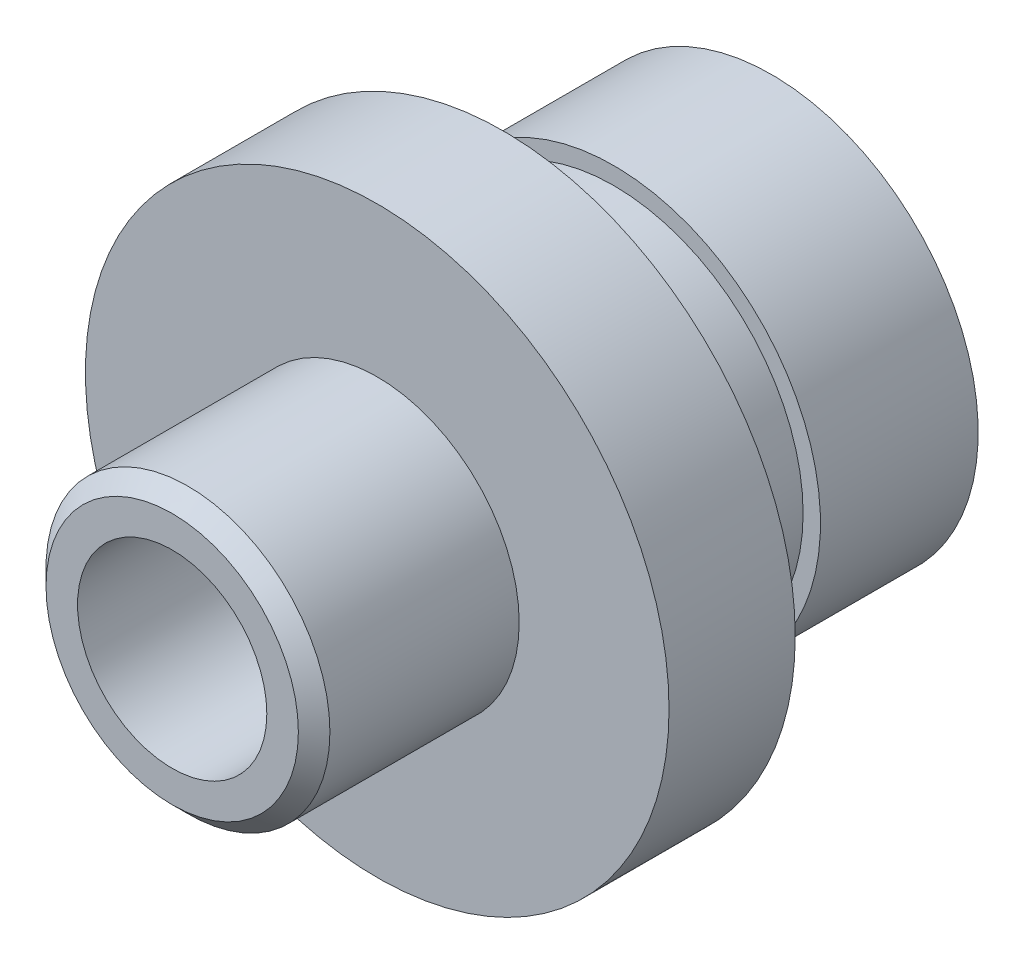
ISO-10303-21;
HEADER;
FILE_DESCRIPTION(('STEP AP214'),'2;1');
FILE_NAME('part.step','',(''),(''),'','','');
FILE_SCHEMA(('AUTOMOTIVE_DESIGN { 1 0 10303 214 1 1 1 1 }'));
ENDSEC;
DATA;
#1=APPLICATION_CONTEXT('core data for automotive mechanical design processes');
#2=APPLICATION_PROTOCOL_DEFINITION('international standard','automotive_design',2000,#1);
#3=PRODUCT_CONTEXT('',#1,'mechanical');
#4=PRODUCT('Part','Part','',(#3));
#5=PRODUCT_RELATED_PRODUCT_CATEGORY('part','',(#4));
#6=PRODUCT_DEFINITION_FORMATION('','',#4);
#7=PRODUCT_DEFINITION_CONTEXT('part definition',#1,'design');
#8=PRODUCT_DEFINITION('design','',#6,#7);
#9=PRODUCT_DEFINITION_SHAPE('','',#8);
#10=(LENGTH_UNIT() NAMED_UNIT(*) SI_UNIT(.MILLI.,.METRE.));
#11=(NAMED_UNIT(*) PLANE_ANGLE_UNIT() SI_UNIT($,.RADIAN.));
#12=(NAMED_UNIT(*) SI_UNIT($,.STERADIAN.) SOLID_ANGLE_UNIT());
#13=UNCERTAINTY_MEASURE_WITH_UNIT(LENGTH_MEASURE(1.E-05),#10,'distance_accuracy_value','');
#14=(GEOMETRIC_REPRESENTATION_CONTEXT(3) GLOBAL_UNCERTAINTY_ASSIGNED_CONTEXT((#13)) GLOBAL_UNIT_ASSIGNED_CONTEXT((#10,
#11,#12)) REPRESENTATION_CONTEXT('',''));
#15=CARTESIAN_POINT('',(0.,0.,0.));
#16=DIRECTION('',(0.,0.,1.));
#17=DIRECTION('',(1.,0.,0.));
#18=AXIS2_PLACEMENT_3D('',#15,#16,#17);
#19=CARTESIAN_POINT('',(0.,0.,0.));
#20=DIRECTION('',(0.,0.,1.));
#21=DIRECTION('',(1.,0.,0.));
#22=AXIS2_PLACEMENT_3D('',#19,#20,#21);
#23=PLANE('',#22);
#24=CARTESIAN_POINT('',(0.,0.,0.));
#25=DIRECTION('',(0.,0.,1.));
#26=DIRECTION('',(1.,0.,0.));
#27=AXIS2_PLACEMENT_3D('',#24,#25,#26);
#28=CIRCLE('',#27,3.);
#29=CARTESIAN_POINT('',(3.,0.,0.));
#30=VERTEX_POINT('',#29);
#31=EDGE_CURVE('E80',#30,#30,#28,.T.);
#32=ORIENTED_EDGE('',*,*,#31,.T.);
#33=EDGE_LOOP('',(#32));
#34=FACE_BOUND('',#33,.T.);
#35=CARTESIAN_POINT('',(0.,0.,0.));
#36=DIRECTION('',(0.,0.,-1.));
#37=DIRECTION('',(-1.,0.,0.));
#38=AXIS2_PLACEMENT_3D('',#35,#36,#37);
#39=CIRCLE('',#38,6.55);
#40=CARTESIAN_POINT('',(-6.55,0.,0.));
#41=VERTEX_POINT('',#40);
#42=EDGE_CURVE('E70',#41,#41,#39,.T.);
#43=ORIENTED_EDGE('',*,*,#42,.T.);
#44=EDGE_LOOP('',(#43));
#45=FACE_BOUND('',#44,.T.);
#46=ADVANCED_FACE('F47',(#34,#45),#23,.F.);
#47=CARTESIAN_POINT('',(0.,0.,19.));
#48=DIRECTION('',(0.,0.,1.));
#49=DIRECTION('',(1.,0.,0.));
#50=AXIS2_PLACEMENT_3D('',#47,#48,#49);
#51=PLANE('',#50);
#52=CARTESIAN_POINT('',(0.,0.,19.));
#53=DIRECTION('',(0.,0.,1.));
#54=DIRECTION('',(1.,0.,0.));
#55=AXIS2_PLACEMENT_3D('',#52,#53,#54);
#56=CIRCLE('',#55,4.00000000000001);
#57=CARTESIAN_POINT('',(4.00000000000001,0.,19.));
#58=VERTEX_POINT('',#57);
#59=EDGE_CURVE('E57',#58,#58,#56,.T.);
#60=ORIENTED_EDGE('',*,*,#59,.T.);
#61=EDGE_LOOP('',(#60));
#62=FACE_BOUND('',#61,.T.);
#63=CARTESIAN_POINT('',(0.,0.,19.));
#64=DIRECTION('',(0.,0.,1.));
#65=DIRECTION('',(1.,0.,0.));
#66=AXIS2_PLACEMENT_3D('',#63,#64,#65);
#67=CIRCLE('',#66,3.);
#68=CARTESIAN_POINT('',(3.,0.,19.));
#69=VERTEX_POINT('',#68);
#70=EDGE_CURVE('E62',#69,#69,#67,.T.);
#71=ORIENTED_EDGE('',*,*,#70,.F.);
#72=EDGE_LOOP('',(#71));
#73=FACE_BOUND('',#72,.T.);
#74=ADVANCED_FACE('F121',(#62,#73),#51,.T.);
#75=CARTESIAN_POINT('',(0.,0.,19.));
#76=DIRECTION('',(0.,0.,-1.));
#77=DIRECTION('',(-1.,0.,0.));
#78=AXIS2_PLACEMENT_3D('',#75,#76,#77);
#79=CYLINDRICAL_SURFACE('',#78,9.25);
#80=CARTESIAN_POINT('',(0.,0.,8.5));
#81=DIRECTION('',(0.,0.,1.));
#82=DIRECTION('',(1.,0.,0.));
#83=AXIS2_PLACEMENT_3D('',#80,#81,#82);
#84=CIRCLE('',#83,9.25);
#85=CARTESIAN_POINT('',(9.25,0.,8.5));
#86=VERTEX_POINT('',#85);
#87=EDGE_CURVE('E71',#86,#86,#84,.T.);
#88=ORIENTED_EDGE('',*,*,#87,.T.);
#89=EDGE_LOOP('',(#88));
#90=FACE_BOUND('',#89,.T.);
#91=CARTESIAN_POINT('',(0.,0.,12.5));
#92=DIRECTION('',(0.,0.,1.));
#93=DIRECTION('',(1.,0.,0.));
#94=AXIS2_PLACEMENT_3D('',#91,#92,#93);
#95=CIRCLE('',#94,9.25);
#96=CARTESIAN_POINT('',(9.25,0.,12.5));
#97=VERTEX_POINT('',#96);
#98=EDGE_CURVE('E76',#97,#97,#95,.T.);
#99=ORIENTED_EDGE('',*,*,#98,.F.);
#100=EDGE_LOOP('',(#99));
#101=FACE_BOUND('',#100,.T.);
#102=ADVANCED_FACE('F127',(#90,#101),#79,.T.);
#103=CARTESIAN_POINT('',(0.,0.,19.));
#104=DIRECTION('',(0.,0.,-1.));
#105=DIRECTION('',(-1.,0.,0.));
#106=AXIS2_PLACEMENT_3D('',#103,#104,#105);
#107=CYLINDRICAL_SURFACE('',#106,3.);
#108=ORIENTED_EDGE('',*,*,#70,.T.);
#109=EDGE_LOOP('',(#108));
#110=FACE_BOUND('',#109,.T.);
#111=ORIENTED_EDGE('',*,*,#31,.F.);
#112=EDGE_LOOP('',(#111));
#113=FACE_BOUND('',#112,.T.);
#114=ADVANCED_FACE('F132',(#110,#113),#107,.F.);
#115=CARTESIAN_POINT('',(0.,0.,12.5));
#116=DIRECTION('',(0.,0.,1.));
#117=DIRECTION('',(1.,0.,0.));
#118=AXIS2_PLACEMENT_3D('',#115,#116,#117);
#119=PLANE('',#118);
#120=CARTESIAN_POINT('',(0.,0.,12.5));
#121=DIRECTION('',(0.,0.,1.));
#122=DIRECTION('',(1.,0.,0.));
#123=AXIS2_PLACEMENT_3D('',#120,#121,#122);
#124=CIRCLE('',#123,4.5);
#125=CARTESIAN_POINT('',(4.5,0.,12.5));
#126=VERTEX_POINT('',#125);
#127=EDGE_CURVE('E75',#126,#126,#124,.T.);
#128=ORIENTED_EDGE('',*,*,#127,.F.);
#129=EDGE_LOOP('',(#128));
#130=FACE_BOUND('',#129,.T.);
#131=ORIENTED_EDGE('',*,*,#98,.T.);
#132=EDGE_LOOP('',(#131));
#133=FACE_BOUND('',#132,.T.);
#134=ADVANCED_FACE('F137',(#130,#133),#119,.T.);
#135=CARTESIAN_POINT('',(0.,0.,12.5));
#136=DIRECTION('',(0.,0.,1.));
#137=DIRECTION('',(1.,0.,0.));
#138=AXIS2_PLACEMENT_3D('',#135,#136,#137);
#139=CYLINDRICAL_SURFACE('',#138,4.5);
#140=CARTESIAN_POINT('',(0.,0.,18.5));
#141=DIRECTION('',(0.,0.,1.));
#142=DIRECTION('',(1.,0.,0.));
#143=AXIS2_PLACEMENT_3D('',#140,#141,#142);
#144=CIRCLE('',#143,4.5);
#145=CARTESIAN_POINT('',(4.5,0.,18.5));
#146=VERTEX_POINT('',#145);
#147=EDGE_CURVE('E12',#146,#146,#144,.F.);
#148=CARTESIAN_POINT('',(4.5,0.,18.5));
#149=CARTESIAN_POINT('',(4.5,0.,18.4375));
#150=CARTESIAN_POINT('',(4.5,0.,18.375));
#151=CARTESIAN_POINT('',(4.5,0.,18.25));
#152=CARTESIAN_POINT('',(4.5,0.,18.1875));
#153=CARTESIAN_POINT('',(4.5,0.,18.0625));
#154=CARTESIAN_POINT('',(4.5,0.,18.));
#155=CARTESIAN_POINT('',(4.5,0.,17.875));
#156=CARTESIAN_POINT('',(4.5,0.,17.8125));
#157=CARTESIAN_POINT('',(4.5,0.,17.6875));
#158=CARTESIAN_POINT('',(4.5,0.,17.625));
#159=CARTESIAN_POINT('',(4.5,0.,17.5));
#160=CARTESIAN_POINT('',(4.5,0.,17.4375));
#161=CARTESIAN_POINT('',(4.5,0.,17.3125));
#162=CARTESIAN_POINT('',(4.5,0.,17.25));
#163=CARTESIAN_POINT('',(4.5,0.,17.125));
#164=CARTESIAN_POINT('',(4.5,0.,17.0625));
#165=CARTESIAN_POINT('',(4.5,0.,16.9375));
#166=CARTESIAN_POINT('',(4.5,0.,16.875));
#167=CARTESIAN_POINT('',(4.5,0.,16.75));
#168=CARTESIAN_POINT('',(4.5,0.,16.6875));
#169=CARTESIAN_POINT('',(4.5,0.,16.5625));
#170=CARTESIAN_POINT('',(4.5,0.,16.5));
#171=CARTESIAN_POINT('',(4.5,0.,16.375));
#172=CARTESIAN_POINT('',(4.5,0.,16.3125));
#173=CARTESIAN_POINT('',(4.5,0.,16.1875));
#174=CARTESIAN_POINT('',(4.5,0.,16.125));
#175=CARTESIAN_POINT('',(4.5,0.,16.));
#176=CARTESIAN_POINT('',(4.5,0.,15.9375));
#177=CARTESIAN_POINT('',(4.5,0.,15.8125));
#178=CARTESIAN_POINT('',(4.5,0.,15.75));
#179=CARTESIAN_POINT('',(4.5,0.,15.625));
#180=CARTESIAN_POINT('',(4.5,0.,15.5625));
#181=CARTESIAN_POINT('',(4.5,0.,15.4375));
#182=CARTESIAN_POINT('',(4.5,0.,15.375));
#183=CARTESIAN_POINT('',(4.5,0.,15.25));
#184=CARTESIAN_POINT('',(4.5,0.,15.1875));
#185=CARTESIAN_POINT('',(4.5,0.,15.0625));
#186=CARTESIAN_POINT('',(4.5,0.,15.));
#187=CARTESIAN_POINT('',(4.5,0.,14.875));
#188=CARTESIAN_POINT('',(4.5,0.,14.8125));
#189=CARTESIAN_POINT('',(4.5,0.,14.6875));
#190=CARTESIAN_POINT('',(4.5,0.,14.625));
#191=CARTESIAN_POINT('',(4.5,0.,14.5));
#192=CARTESIAN_POINT('',(4.5,0.,14.4375));
#193=CARTESIAN_POINT('',(4.5,0.,14.3125));
#194=CARTESIAN_POINT('',(4.5,0.,14.25));
#195=CARTESIAN_POINT('',(4.5,0.,14.125));
#196=CARTESIAN_POINT('',(4.5,0.,14.0625));
#197=CARTESIAN_POINT('',(4.5,0.,13.9375));
#198=CARTESIAN_POINT('',(4.5,0.,13.875));
#199=CARTESIAN_POINT('',(4.5,0.,13.75));
#200=CARTESIAN_POINT('',(4.5,0.,13.6875));
#201=CARTESIAN_POINT('',(4.5,0.,13.5625));
#202=CARTESIAN_POINT('',(4.5,0.,13.5));
#203=CARTESIAN_POINT('',(4.5,0.,13.375));
#204=CARTESIAN_POINT('',(4.5,0.,13.3125));
#205=CARTESIAN_POINT('',(4.5,0.,13.1875));
#206=CARTESIAN_POINT('',(4.5,0.,13.125));
#207=CARTESIAN_POINT('',(4.5,0.,13.));
#208=CARTESIAN_POINT('',(4.5,0.,12.9375));
#209=CARTESIAN_POINT('',(4.5,0.,12.8125));
#210=CARTESIAN_POINT('',(4.5,0.,12.75));
#211=CARTESIAN_POINT('',(4.5,0.,12.625));
#212=CARTESIAN_POINT('',(4.5,0.,12.5625));
#213=CARTESIAN_POINT('',(4.5,0.,12.5));
#214=B_SPLINE_CURVE_WITH_KNOTS('',3,(#148,#149,#150,#151,#152,#153,#154,#155,#156,#157,#158,
#159,#160,#161,#162,#163,#164,#165,#166,#167,#168,#169,#170,#171,#172,#173,#174,#175,#176,#177,
#178,#179,#180,#181,#182,#183,#184,#185,#186,#187,#188,#189,#190,#191,#192,#193,#194,#195,#196,
#197,#198,#199,#200,#201,#202,#203,#204,#205,#206,#207,#208,#209,#210,#211,#212,#213),
.UNSPECIFIED.,.F.,.F.,(4,2,2,2,2,2,2,2,2,2,2,2,2,2,2,2,2,2,2,2,2,2,2,2,2,2,2,2,2,2,2,2,4),(0.,
0.1875,0.375,0.5625,0.750000000000001,0.937500000000001,1.125,1.3125,1.5,1.6875,1.875,2.0625,
2.25,2.4375,2.625,2.8125,3.,3.1875,3.375,3.5625,3.75,3.93750000000001,4.12500000000001,
4.31250000000001,4.50000000000001,4.68750000000001,4.87500000000001,5.06250000000001,
5.25000000000001,5.43750000000001,5.62500000000001,5.81250000000001,6.00000000000001),.UNSPECIFIED.);
#215=EDGE_CURVE('BSEAM144',#146,#126,#214,.T.);
#216=ORIENTED_EDGE('',*,*,#147,.T.);
#217=ORIENTED_EDGE('',*,*,#127,.T.);
#218=ORIENTED_EDGE('',*,*,#215,.T.);
#219=ORIENTED_EDGE('',*,*,#215,.F.);
#220=EDGE_LOOP('',(#216,#218,#217,#219));
#221=FACE_BOUND('',#220,.T.);
#222=ADVANCED_FACE('F144',(#221),#139,.T.);
#223=CARTESIAN_POINT('',(0.,0.,8.5));
#224=DIRECTION('',(0.,0.,1.));
#225=DIRECTION('',(1.,0.,0.));
#226=AXIS2_PLACEMENT_3D('',#223,#224,#225);
#227=PLANE('',#226);
#228=CARTESIAN_POINT('',(0.,0.,8.5));
#229=DIRECTION('',(0.,0.,1.));
#230=DIRECTION('',(1.,0.,0.));
#231=AXIS2_PLACEMENT_3D('',#228,#229,#230);
#232=CIRCLE('',#231,6.8);
#233=CARTESIAN_POINT('',(6.8,0.,8.5));
#234=VERTEX_POINT('',#233);
#235=EDGE_CURVE('E69',#234,#234,#232,.F.);
#236=ORIENTED_EDGE('',*,*,#235,.F.);
#237=EDGE_LOOP('',(#236));
#238=FACE_BOUND('',#237,.T.);
#239=ORIENTED_EDGE('',*,*,#87,.F.);
#240=EDGE_LOOP('',(#239));
#241=FACE_BOUND('',#240,.T.);
#242=ADVANCED_FACE('F150',(#238,#241),#227,.F.);
#243=CARTESIAN_POINT('',(0.,0.,39.871997988008));
#244=DIRECTION('',(0.,0.,-1.));
#245=DIRECTION('',(-1.,0.,0.));
#246=AXIS2_PLACEMENT_3D('',#243,#244,#245);
#247=CYLINDRICAL_SURFACE('',#246,6.8);
#248=CARTESIAN_POINT('',(0.,0.,7.));
#249=DIRECTION('',(0.,0.,1.));
#250=DIRECTION('',(1.,0.,0.));
#251=AXIS2_PLACEMENT_3D('',#248,#249,#250);
#252=CIRCLE('',#251,6.8);
#253=CARTESIAN_POINT('',(6.8,0.,7.));
#254=VERTEX_POINT('',#253);
#255=EDGE_CURVE('E65',#254,#254,#252,.F.);
#256=ORIENTED_EDGE('',*,*,#255,.F.);
#257=EDGE_LOOP('',(#256));
#258=FACE_BOUND('',#257,.T.);
#259=ORIENTED_EDGE('',*,*,#235,.T.);
#260=EDGE_LOOP('',(#259));
#261=FACE_BOUND('',#260,.T.);
#262=ADVANCED_FACE('F116',(#258,#261),#247,.T.);
#263=CARTESIAN_POINT('',(0.,0.,35.871997988008));
#264=DIRECTION('',(0.,0.,-1.));
#265=DIRECTION('',(-1.,0.,0.));
#266=AXIS2_PLACEMENT_3D('',#263,#264,#265);
#267=CYLINDRICAL_SURFACE('',#266,6.55);
#268=CARTESIAN_POINT('',(0.,0.,5.));
#269=DIRECTION('',(0.,0.,-1.));
#270=DIRECTION('',(-1.,0.,0.));
#271=AXIS2_PLACEMENT_3D('',#268,#269,#270);
#272=CIRCLE('',#271,6.55);
#273=CARTESIAN_POINT('',(-6.55,0.,5.));
#274=VERTEX_POINT('',#273);
#275=EDGE_CURVE('E52',#274,#274,#272,.F.);
#276=ORIENTED_EDGE('',*,*,#275,.F.);
#277=EDGE_LOOP('',(#276));
#278=FACE_BOUND('',#277,.T.);
#279=ORIENTED_EDGE('',*,*,#42,.F.);
#280=EDGE_LOOP('',(#279));
#281=FACE_BOUND('',#280,.T.);
#282=ADVANCED_FACE('F112',(#278,#281),#267,.T.);
#283=CARTESIAN_POINT('',(0.,0.,7.));
#284=DIRECTION('',(0.,0.,1.));
#285=DIRECTION('',(1.,0.,0.));
#286=AXIS2_PLACEMENT_3D('',#283,#284,#285);
#287=PLANE('',#286);
#288=ORIENTED_EDGE('',*,*,#255,.T.);
#289=EDGE_LOOP('',(#288));
#290=FACE_BOUND('',#289,.T.);
#291=CARTESIAN_POINT('',(0.,0.,7.));
#292=DIRECTION('',(0.,0.,-1.));
#293=DIRECTION('',(-1.,0.,0.));
#294=AXIS2_PLACEMENT_3D('',#291,#292,#293);
#295=CIRCLE('',#294,6.);
#296=CARTESIAN_POINT('',(-6.,0.,7.));
#297=VERTEX_POINT('',#296);
#298=EDGE_CURVE('E100',#297,#297,#295,.T.);
#299=ORIENTED_EDGE('',*,*,#298,.F.);
#300=EDGE_LOOP('',(#299));
#301=FACE_BOUND('',#300,.T.);
#302=ADVANCED_FACE('F115',(#290,#301),#287,.F.);
#303=CARTESIAN_POINT('',(0.,0.,19.));
#304=DIRECTION('',(0.,0.,-1.));
#305=DIRECTION('',(-1.,0.,0.));
#306=AXIS2_PLACEMENT_3D('',#303,#304,#305);
#307=CONICAL_SURFACE('',#306,4.00000000000001,0.785398163397445);
#308=ORIENTED_EDGE('',*,*,#147,.F.);
#309=EDGE_LOOP('',(#308));
#310=FACE_BOUND('',#309,.T.);
#311=ORIENTED_EDGE('',*,*,#59,.F.);
#312=EDGE_LOOP('',(#311));
#313=FACE_BOUND('',#312,.T.);
#314=ADVANCED_FACE('F50',(#310,#313),#307,.T.);
#315=CARTESIAN_POINT('',(0.,0.,5.));
#316=DIRECTION('',(0.,0.,-1.));
#317=DIRECTION('',(-1.,0.,0.));
#318=AXIS2_PLACEMENT_3D('',#315,#316,#317);
#319=PLANE('',#318);
#320=ORIENTED_EDGE('',*,*,#275,.T.);
#321=EDGE_LOOP('',(#320));
#322=FACE_BOUND('',#321,.T.);
#323=CARTESIAN_POINT('',(0.,0.,5.));
#324=DIRECTION('',(0.,0.,-1.));
#325=DIRECTION('',(-1.,0.,0.));
#326=AXIS2_PLACEMENT_3D('',#323,#324,#325);
#327=CIRCLE('',#326,6.);
#328=CARTESIAN_POINT('',(-6.,0.,5.));
#329=VERTEX_POINT('',#328);
#330=EDGE_CURVE('E96',#329,#329,#327,.T.);
#331=ORIENTED_EDGE('',*,*,#330,.T.);
#332=EDGE_LOOP('',(#331));
#333=FACE_BOUND('',#332,.T.);
#334=ADVANCED_FACE('F109',(#322,#333),#319,.F.);
#335=CARTESIAN_POINT('',(0.,0.,7.));
#336=DIRECTION('',(0.,0.,-1.));
#337=DIRECTION('',(-1.,0.,0.));
#338=AXIS2_PLACEMENT_3D('',#335,#336,#337);
#339=CYLINDRICAL_SURFACE('',#338,6.);
#340=ORIENTED_EDGE('',*,*,#298,.T.);
#341=EDGE_LOOP('',(#340));
#342=FACE_BOUND('',#341,.T.);
#343=ORIENTED_EDGE('',*,*,#330,.F.);
#344=EDGE_LOOP('',(#343));
#345=FACE_BOUND('',#344,.T.);
#346=ADVANCED_FACE('F165',(#342,#345),#339,.T.);
#347=CLOSED_SHELL('',(#46,#74,#102,#114,#134,#222,#242,#262,#282,#302,#314,#334,#346));
#348=MANIFOLD_SOLID_BREP('B2',#347);
#349=ADVANCED_BREP_SHAPE_REPRESENTATION('',(#18,#348),#14);
#350=SHAPE_DEFINITION_REPRESENTATION(#9,#349);
ENDSEC;
END-ISO-10303-21;
